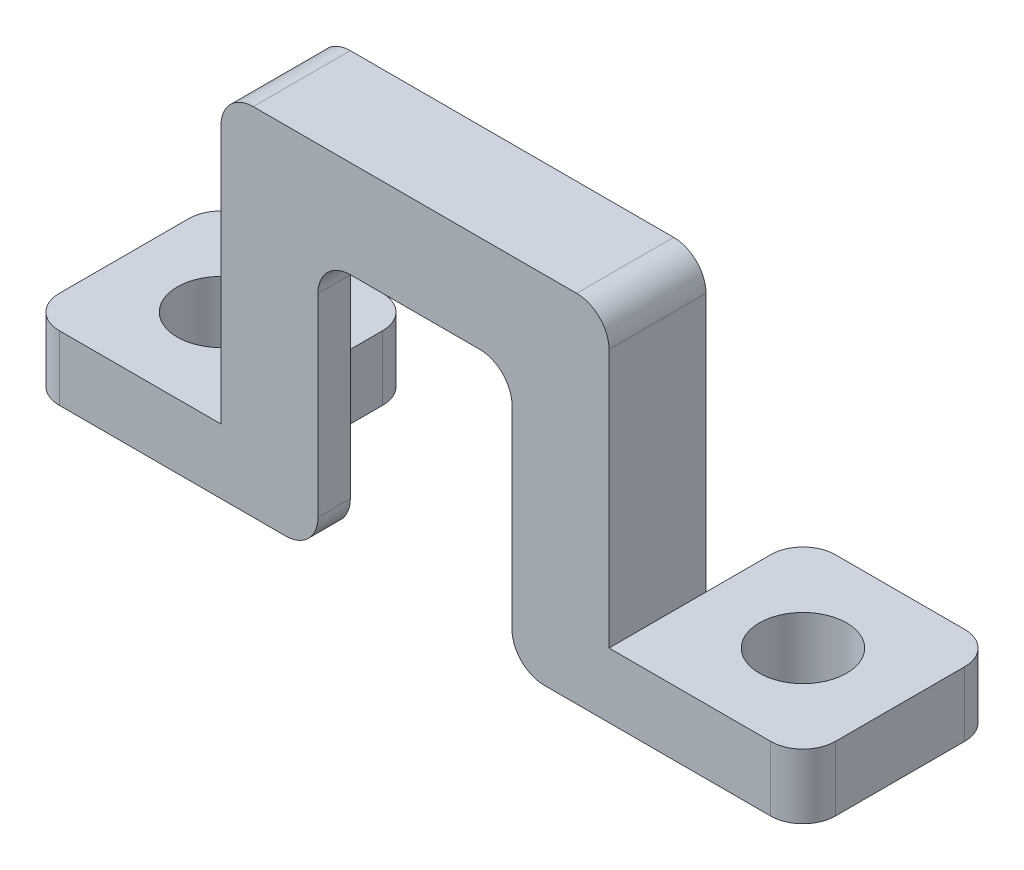
ISO-10303-21;
HEADER;
FILE_DESCRIPTION(('STEP AP214'),'2;1');
FILE_NAME('part.step','',(''),(''),'','','');
FILE_SCHEMA(('AUTOMOTIVE_DESIGN { 1 0 10303 214 1 1 1 1 }'));
ENDSEC;
DATA;
#1=APPLICATION_CONTEXT('core data for automotive mechanical design processes');
#2=APPLICATION_PROTOCOL_DEFINITION('international standard','automotive_design',2000,#1);
#3=PRODUCT_CONTEXT('',#1,'mechanical');
#4=PRODUCT('Part','Part','',(#3));
#5=PRODUCT_RELATED_PRODUCT_CATEGORY('part','',(#4));
#6=PRODUCT_DEFINITION_FORMATION('','',#4);
#7=PRODUCT_DEFINITION_CONTEXT('part definition',#1,'design');
#8=PRODUCT_DEFINITION('design','',#6,#7);
#9=PRODUCT_DEFINITION_SHAPE('','',#8);
#10=(LENGTH_UNIT() NAMED_UNIT(*) SI_UNIT(.MILLI.,.METRE.));
#11=(NAMED_UNIT(*) PLANE_ANGLE_UNIT() SI_UNIT($,.RADIAN.));
#12=(NAMED_UNIT(*) SI_UNIT($,.STERADIAN.) SOLID_ANGLE_UNIT());
#13=UNCERTAINTY_MEASURE_WITH_UNIT(LENGTH_MEASURE(1.E-05),#10,'distance_accuracy_value','');
#14=(GEOMETRIC_REPRESENTATION_CONTEXT(3) GLOBAL_UNCERTAINTY_ASSIGNED_CONTEXT((#13)) GLOBAL_UNIT_ASSIGNED_CONTEXT((#10,
#11,#12)) REPRESENTATION_CONTEXT('',''));
#15=CARTESIAN_POINT('',(0.,0.,0.));
#16=DIRECTION('',(0.,0.,1.));
#17=DIRECTION('',(1.,0.,0.));
#18=AXIS2_PLACEMENT_3D('',#15,#16,#17);
#19=CARTESIAN_POINT('',(0.,0.,0.));
#20=DIRECTION('',(0.,0.,1.));
#21=DIRECTION('',(1.,0.,0.));
#22=AXIS2_PLACEMENT_3D('',#19,#20,#21);
#23=PLANE('',#22);
#24=DIRECTION('',(0.,1.,0.));
#25=VECTOR('',#24,1.);
#26=CARTESIAN_POINT('',(5.08,0.,0.));
#27=LINE('',#26,#25);
#28=CARTESIAN_POINT('',(5.08,2.54,0.));
#29=VERTEX_POINT('',#28);
#30=CARTESIAN_POINT('',(5.08,17.78,0.));
#31=VERTEX_POINT('',#30);
#32=EDGE_CURVE('E443',#29,#31,#27,.T.);
#33=ORIENTED_EDGE('',*,*,#32,.F.);
#34=CARTESIAN_POINT('',(2.54,2.54,0.));
#35=DIRECTION('',(0.,0.,1.));
#36=DIRECTION('',(1.,0.,0.));
#37=AXIS2_PLACEMENT_3D('',#34,#35,#36);
#38=CIRCLE('',#37,2.54);
#39=CARTESIAN_POINT('',(2.54,0.,0.));
#40=VERTEX_POINT('',#39);
#41=EDGE_CURVE('E473',#29,#40,#38,.F.);
#42=ORIENTED_EDGE('',*,*,#41,.T.);
#43=DIRECTION('',(1.,0.,0.));
#44=VECTOR('',#43,1.);
#45=CARTESIAN_POINT('',(0.,0.,0.));
#46=LINE('',#45,#44);
#47=CARTESIAN_POINT('',(0.,0.,0.));
#48=VERTEX_POINT('',#47);
#49=EDGE_CURVE('E439',#48,#40,#46,.T.);
#50=ORIENTED_EDGE('',*,*,#49,.F.);
#51=DIRECTION('',(0.,1.,0.));
#52=VECTOR('',#51,1.);
#53=CARTESIAN_POINT('',(0.,0.,0.));
#54=LINE('',#53,#52);
#55=CARTESIAN_POINT('',(0.,25.4,0.));
#56=VERTEX_POINT('',#55);
#57=EDGE_CURVE('E379',#48,#56,#54,.T.);
#58=ORIENTED_EDGE('',*,*,#57,.T.);
#59=DIRECTION('',(1.,0.,0.));
#60=VECTOR('',#59,1.);
#61=CARTESIAN_POINT('',(0.,25.4,0.));
#62=LINE('',#61,#60);
#63=CARTESIAN_POINT('',(25.4,25.4,0.));
#64=VERTEX_POINT('',#63);
#65=EDGE_CURVE('E354',#56,#64,#62,.T.);
#66=ORIENTED_EDGE('',*,*,#65,.T.);
#67=DIRECTION('',(0.,1.,0.));
#68=VECTOR('',#67,1.);
#69=CARTESIAN_POINT('',(25.4,0.,0.));
#70=LINE('',#69,#68);
#71=CARTESIAN_POINT('',(25.4,0.,0.));
#72=VERTEX_POINT('',#71);
#73=EDGE_CURVE('E338',#72,#64,#70,.T.);
#74=ORIENTED_EDGE('',*,*,#73,.F.);
#75=DIRECTION('',(1.,0.,0.));
#76=VECTOR('',#75,1.);
#77=CARTESIAN_POINT('',(0.,0.,0.));
#78=LINE('',#77,#76);
#79=CARTESIAN_POINT('',(22.86,0.,0.));
#80=VERTEX_POINT('',#79);
#81=EDGE_CURVE('E436',#80,#72,#78,.T.);
#82=ORIENTED_EDGE('',*,*,#81,.F.);
#83=CARTESIAN_POINT('',(22.86,2.54,0.));
#84=DIRECTION('',(0.,0.,1.));
#85=DIRECTION('',(1.,0.,0.));
#86=AXIS2_PLACEMENT_3D('',#83,#84,#85);
#87=CIRCLE('',#86,2.54);
#88=CARTESIAN_POINT('',(20.32,2.54,0.));
#89=VERTEX_POINT('',#88);
#90=EDGE_CURVE('E470',#80,#89,#87,.F.);
#91=ORIENTED_EDGE('',*,*,#90,.T.);
#92=DIRECTION('',(0.,1.,0.));
#93=VECTOR('',#92,1.);
#94=CARTESIAN_POINT('',(20.32,0.,0.));
#95=LINE('',#94,#93);
#96=CARTESIAN_POINT('',(20.32,17.78,0.));
#97=VERTEX_POINT('',#96);
#98=EDGE_CURVE('E390',#89,#97,#95,.T.);
#99=ORIENTED_EDGE('',*,*,#98,.T.);
#100=CARTESIAN_POINT('',(17.78,17.78,0.));
#101=DIRECTION('',(0.,0.,1.));
#102=DIRECTION('',(1.,0.,0.));
#103=AXIS2_PLACEMENT_3D('',#100,#101,#102);
#104=CIRCLE('',#103,2.54);
#105=CARTESIAN_POINT('',(17.78,20.32,0.));
#106=VERTEX_POINT('',#105);
#107=EDGE_CURVE('E588',#97,#106,#104,.T.);
#108=ORIENTED_EDGE('',*,*,#107,.T.);
#109=DIRECTION('',(1.,0.,0.));
#110=VECTOR('',#109,1.);
#111=CARTESIAN_POINT('',(0.,20.32,0.));
#112=LINE('',#111,#110);
#113=CARTESIAN_POINT('',(7.62,20.32,0.));
#114=VERTEX_POINT('',#113);
#115=EDGE_CURVE('E405',#114,#106,#112,.T.);
#116=ORIENTED_EDGE('',*,*,#115,.F.);
#117=CARTESIAN_POINT('',(7.62,17.78,0.));
#118=DIRECTION('',(0.,0.,1.));
#119=DIRECTION('',(1.,0.,0.));
#120=AXIS2_PLACEMENT_3D('',#117,#118,#119);
#121=CIRCLE('',#120,2.54);
#122=EDGE_CURVE('E56',#114,#31,#121,.T.);
#123=ORIENTED_EDGE('',*,*,#122,.T.);
#124=EDGE_LOOP('',(#33,#42,#50,#58,#66,#74,#82,#91,#99,#108,#116,#123));
#125=FACE_BOUND('',#124,.T.);
#126=ADVANCED_FACE('F47',(#125),#23,.F.);
#127=CARTESIAN_POINT('',(20.32,0.,2.54));
#128=DIRECTION('',(-1.,0.,0.));
#129=DIRECTION('',(0.,0.,1.));
#130=AXIS2_PLACEMENT_3D('',#127,#128,#129);
#131=PLANE('',#130);
#132=DIRECTION('',(0.,1.,0.));
#133=VECTOR('',#132,1.);
#134=CARTESIAN_POINT('',(20.32,0.,2.54));
#135=LINE('',#134,#133);
#136=CARTESIAN_POINT('',(20.32,2.54,2.54));
#137=VERTEX_POINT('',#136);
#138=CARTESIAN_POINT('',(20.32,17.78,2.54));
#139=VERTEX_POINT('',#138);
#140=EDGE_CURVE('E400',#137,#139,#135,.T.);
#141=ORIENTED_EDGE('',*,*,#140,.T.);
#142=DIRECTION('',(0.,0.,-1.));
#143=VECTOR('',#142,1.);
#144=CARTESIAN_POINT('',(20.32,17.78,2.54));
#145=LINE('',#144,#143);
#146=EDGE_CURVE('E452',#139,#97,#145,.T.);
#147=ORIENTED_EDGE('',*,*,#146,.T.);
#148=ORIENTED_EDGE('',*,*,#98,.F.);
#149=DIRECTION('',(0.,0.,-1.));
#150=VECTOR('',#149,1.);
#151=CARTESIAN_POINT('',(20.32,2.54,2.54));
#152=LINE('',#151,#150);
#153=EDGE_CURVE('E432',#89,#137,#152,.F.);
#154=ORIENTED_EDGE('',*,*,#153,.T.);
#155=EDGE_LOOP('',(#141,#147,#148,#154));
#156=FACE_BOUND('',#155,.T.);
#157=ADVANCED_FACE('F619',(#156),#131,.T.);
#158=CARTESIAN_POINT('',(0.,0.,2.54));
#159=DIRECTION('',(0.,1.,0.));
#160=DIRECTION('',(0.,0.,1.));
#161=AXIS2_PLACEMENT_3D('',#158,#159,#160);
#162=PLANE('',#161);
#163=DIRECTION('',(1.,0.,0.));
#164=VECTOR('',#163,1.);
#165=CARTESIAN_POINT('',(0.,0.,2.54));
#166=LINE('',#165,#164);
#167=CARTESIAN_POINT('',(22.86,0.,2.54));
#168=VERTEX_POINT('',#167);
#169=CARTESIAN_POINT('',(40.64,0.,2.54));
#170=VERTEX_POINT('',#169);
#171=EDGE_CURVE('E404',#168,#170,#166,.T.);
#172=ORIENTED_EDGE('',*,*,#171,.F.);
#173=DIRECTION('',(0.,0.,-1.));
#174=VECTOR('',#173,1.);
#175=CARTESIAN_POINT('',(22.86,0.,0.));
#176=LINE('',#175,#174);
#177=EDGE_CURVE('E516',#168,#80,#176,.T.);
#178=ORIENTED_EDGE('',*,*,#177,.T.);
#179=ORIENTED_EDGE('',*,*,#81,.T.);
#180=DIRECTION('',(0.,0.,1.));
#181=VECTOR('',#180,1.);
#182=CARTESIAN_POINT('',(25.4,0.,-5.08));
#183=LINE('',#182,#181);
#184=CARTESIAN_POINT('',(25.4,0.,-5.08));
#185=VERTEX_POINT('',#184);
#186=EDGE_CURVE('E376',#185,#72,#183,.T.);
#187=ORIENTED_EDGE('',*,*,#186,.F.);
#188=DIRECTION('',(1.,0.,0.));
#189=VECTOR('',#188,1.);
#190=CARTESIAN_POINT('',(0.,0.,-5.08));
#191=LINE('',#190,#189);
#192=CARTESIAN_POINT('',(27.94,0.,-5.08));
#193=VERTEX_POINT('',#192);
#194=EDGE_CURVE('E353',#185,#193,#191,.T.);
#195=ORIENTED_EDGE('',*,*,#194,.T.);
#196=DIRECTION('',(0.,0.,-1.));
#197=VECTOR('',#196,1.);
#198=CARTESIAN_POINT('',(27.94,0.,2.54));
#199=LINE('',#198,#197);
#200=CARTESIAN_POINT('',(27.94,0.,-10.16));
#201=VERTEX_POINT('',#200);
#202=EDGE_CURVE('E318',#193,#201,#199,.T.);
#203=ORIENTED_EDGE('',*,*,#202,.T.);
#204=CARTESIAN_POINT('',(30.48,0.,-10.16));
#205=DIRECTION('',(0.,1.,0.));
#206=DIRECTION('',(0.,0.,1.));
#207=AXIS2_PLACEMENT_3D('',#204,#205,#206);
#208=CIRCLE('',#207,2.54);
#209=CARTESIAN_POINT('',(30.48,0.,-12.7));
#210=VERTEX_POINT('',#209);
#211=EDGE_CURVE('E513',#201,#210,#208,.F.);
#212=ORIENTED_EDGE('',*,*,#211,.T.);
#213=DIRECTION('',(1.,0.,0.));
#214=VECTOR('',#213,1.);
#215=CARTESIAN_POINT('',(27.94,0.,-12.7));
#216=LINE('',#215,#214);
#217=CARTESIAN_POINT('',(40.64,0.,-12.7));
#218=VERTEX_POINT('',#217);
#219=EDGE_CURVE('E342',#210,#218,#216,.T.);
#220=ORIENTED_EDGE('',*,*,#219,.T.);
#221=CARTESIAN_POINT('',(40.64,0.,-10.16));
#222=DIRECTION('',(0.,1.,0.));
#223=DIRECTION('',(0.,0.,1.));
#224=AXIS2_PLACEMENT_3D('',#221,#222,#223);
#225=CIRCLE('',#224,2.54);
#226=CARTESIAN_POINT('',(43.18,0.,-10.16));
#227=VERTEX_POINT('',#226);
#228=EDGE_CURVE('E510',#218,#227,#225,.F.);
#229=ORIENTED_EDGE('',*,*,#228,.T.);
#230=DIRECTION('',(0.,0.,1.));
#231=VECTOR('',#230,1.);
#232=CARTESIAN_POINT('',(43.18,0.,2.54));
#233=LINE('',#232,#231);
#234=CARTESIAN_POINT('',(43.18,0.,0.));
#235=VERTEX_POINT('',#234);
#236=EDGE_CURVE('E346',#227,#235,#233,.T.);
#237=ORIENTED_EDGE('',*,*,#236,.T.);
#238=CARTESIAN_POINT('',(40.64,0.,0.));
#239=DIRECTION('',(0.,1.,0.));
#240=DIRECTION('',(0.,0.,1.));
#241=AXIS2_PLACEMENT_3D('',#238,#239,#240);
#242=CIRCLE('',#241,2.54);
#243=EDGE_CURVE('E507',#235,#170,#242,.F.);
#244=ORIENTED_EDGE('',*,*,#243,.T.);
#245=EDGE_LOOP('',(#172,#178,#179,#187,#195,#203,#212,#220,#229,#237,#244));
#246=FACE_BOUND('',#245,.T.);
#247=CARTESIAN_POINT('',(35.56,0.,-5.08));
#248=DIRECTION('',(0.,-1.,0.));
#249=DIRECTION('',(0.,0.,-1.));
#250=AXIS2_PLACEMENT_3D('',#247,#248,#249);
#251=CIRCLE('',#250,3.429);
#252=CARTESIAN_POINT('',(35.56,0.,-8.509));
#253=VERTEX_POINT('',#252);
#254=EDGE_CURVE('E303',#253,#253,#251,.T.);
#255=ORIENTED_EDGE('',*,*,#254,.F.);
#256=EDGE_LOOP('',(#255));
#257=FACE_BOUND('',#256,.T.);
#258=ADVANCED_FACE('F628',(#246,#257),#162,.F.);
#259=CARTESIAN_POINT('',(27.94,0.,2.54));
#260=DIRECTION('',(-1.,0.,0.));
#261=DIRECTION('',(0.,0.,1.));
#262=AXIS2_PLACEMENT_3D('',#259,#260,#261);
#263=PLANE('',#262);
#264=DIRECTION('',(0.,1.,0.));
#265=VECTOR('',#264,1.);
#266=CARTESIAN_POINT('',(27.94,0.,-5.08));
#267=LINE('',#266,#265);
#268=CARTESIAN_POINT('',(27.94,5.08,-5.08));
#269=VERTEX_POINT('',#268);
#270=CARTESIAN_POINT('',(27.94,25.4,-5.08));
#271=VERTEX_POINT('',#270);
#272=EDGE_CURVE('E358',#269,#271,#267,.T.);
#273=ORIENTED_EDGE('',*,*,#272,.T.);
#274=DIRECTION('',(0.,0.,-1.));
#275=VECTOR('',#274,1.);
#276=CARTESIAN_POINT('',(27.94,25.4,2.54));
#277=LINE('',#276,#275);
#278=CARTESIAN_POINT('',(27.94,25.4,2.54));
#279=VERTEX_POINT('',#278);
#280=EDGE_CURVE('E535',#271,#279,#277,.F.);
#281=ORIENTED_EDGE('',*,*,#280,.T.);
#282=DIRECTION('',(0.,1.,0.));
#283=VECTOR('',#282,1.);
#284=CARTESIAN_POINT('',(27.94,0.,2.54));
#285=LINE('',#284,#283);
#286=CARTESIAN_POINT('',(27.94,5.08,2.54));
#287=VERTEX_POINT('',#286);
#288=EDGE_CURVE('E409',#287,#279,#285,.T.);
#289=ORIENTED_EDGE('',*,*,#288,.F.);
#290=DIRECTION('',(0.,0.,-1.));
#291=VECTOR('',#290,1.);
#292=CARTESIAN_POINT('',(27.94,5.08,2.54));
#293=LINE('',#292,#291);
#294=EDGE_CURVE('E322',#287,#269,#293,.T.);
#295=ORIENTED_EDGE('',*,*,#294,.T.);
#296=EDGE_LOOP('',(#273,#281,#289,#295));
#297=FACE_BOUND('',#296,.T.);
#298=ADVANCED_FACE('F667',(#297),#263,.F.);
#299=CARTESIAN_POINT('',(0.,27.94,2.54));
#300=DIRECTION('',(0.,1.,0.));
#301=DIRECTION('',(0.,0.,1.));
#302=AXIS2_PLACEMENT_3D('',#299,#300,#301);
#303=PLANE('',#302);
#304=DIRECTION('',(1.,0.,0.));
#305=VECTOR('',#304,1.);
#306=CARTESIAN_POINT('',(0.,27.94,-5.08));
#307=LINE('',#306,#305);
#308=CARTESIAN_POINT('',(0.,27.94,-5.08));
#309=VERTEX_POINT('',#308);
#310=CARTESIAN_POINT('',(25.4,27.94,-5.08));
#311=VERTEX_POINT('',#310);
#312=EDGE_CURVE('E276',#309,#311,#307,.T.);
#313=ORIENTED_EDGE('',*,*,#312,.F.);
#314=DIRECTION('',(0.,0.,-1.));
#315=VECTOR('',#314,1.);
#316=CARTESIAN_POINT('',(0.,27.94,2.54));
#317=LINE('',#316,#315);
#318=CARTESIAN_POINT('',(0.,27.94,2.54));
#319=VERTEX_POINT('',#318);
#320=EDGE_CURVE('E532',#309,#319,#317,.F.);
#321=ORIENTED_EDGE('',*,*,#320,.T.);
#322=DIRECTION('',(1.,0.,0.));
#323=VECTOR('',#322,1.);
#324=CARTESIAN_POINT('',(0.,27.94,2.54));
#325=LINE('',#324,#323);
#326=CARTESIAN_POINT('',(25.4,27.94,2.54));
#327=VERTEX_POINT('',#326);
#328=EDGE_CURVE('E413',#319,#327,#325,.T.);
#329=ORIENTED_EDGE('',*,*,#328,.T.);
#330=DIRECTION('',(0.,0.,-1.));
#331=VECTOR('',#330,1.);
#332=CARTESIAN_POINT('',(25.4,27.94,-5.08));
#333=LINE('',#332,#331);
#334=EDGE_CURVE('E528',#327,#311,#333,.T.);
#335=ORIENTED_EDGE('',*,*,#334,.T.);
#336=EDGE_LOOP('',(#313,#321,#329,#335));
#337=FACE_BOUND('',#336,.T.);
#338=ADVANCED_FACE('F677',(#337),#303,.T.);
#339=CARTESIAN_POINT('',(-2.54,0.,2.54));
#340=DIRECTION('',(-1.,0.,0.));
#341=DIRECTION('',(0.,0.,1.));
#342=AXIS2_PLACEMENT_3D('',#339,#340,#341);
#343=PLANE('',#342);
#344=DIRECTION('',(0.,1.,0.));
#345=VECTOR('',#344,1.);
#346=CARTESIAN_POINT('',(-2.54,0.,2.54));
#347=LINE('',#346,#345);
#348=CARTESIAN_POINT('',(-2.54,5.08,2.54));
#349=VERTEX_POINT('',#348);
#350=CARTESIAN_POINT('',(-2.54,25.4,2.54));
#351=VERTEX_POINT('',#350);
#352=EDGE_CURVE('E417',#349,#351,#347,.T.);
#353=ORIENTED_EDGE('',*,*,#352,.T.);
#354=DIRECTION('',(0.,0.,-1.));
#355=VECTOR('',#354,1.);
#356=CARTESIAN_POINT('',(-2.54,25.4,2.54));
#357=LINE('',#356,#355);
#358=CARTESIAN_POINT('',(-2.54,25.4,-5.08));
#359=VERTEX_POINT('',#358);
#360=EDGE_CURVE('E274',#351,#359,#357,.T.);
#361=ORIENTED_EDGE('',*,*,#360,.T.);
#362=DIRECTION('',(0.,1.,0.));
#363=VECTOR('',#362,1.);
#364=CARTESIAN_POINT('',(-2.54,0.,-5.08));
#365=LINE('',#364,#363);
#366=CARTESIAN_POINT('',(-2.54,5.08,-5.08));
#367=VERTEX_POINT('',#366);
#368=EDGE_CURVE('E255',#367,#359,#365,.T.);
#369=ORIENTED_EDGE('',*,*,#368,.F.);
#370=DIRECTION('',(0.,0.,-1.));
#371=VECTOR('',#370,1.);
#372=CARTESIAN_POINT('',(-2.54,5.08,2.54));
#373=LINE('',#372,#371);
#374=EDGE_CURVE('E271',#349,#367,#373,.T.);
#375=ORIENTED_EDGE('',*,*,#374,.F.);
#376=EDGE_LOOP('',(#353,#361,#369,#375));
#377=FACE_BOUND('',#376,.T.);
#378=ADVANCED_FACE('F269',(#377),#343,.T.);
#379=CARTESIAN_POINT('',(0.,0.,2.54));
#380=DIRECTION('',(0.,1.,0.));
#381=DIRECTION('',(0.,0.,1.));
#382=AXIS2_PLACEMENT_3D('',#379,#380,#381);
#383=PLANE('',#382);
#384=ORIENTED_EDGE('',*,*,#49,.T.);
#385=DIRECTION('',(0.,0.,-1.));
#386=VECTOR('',#385,1.);
#387=CARTESIAN_POINT('',(2.54,0.,2.54));
#388=LINE('',#387,#386);
#389=CARTESIAN_POINT('',(2.54,0.,2.54));
#390=VERTEX_POINT('',#389);
#391=EDGE_CURVE('E485',#40,#390,#388,.F.);
#392=ORIENTED_EDGE('',*,*,#391,.T.);
#393=DIRECTION('',(1.,0.,0.));
#394=VECTOR('',#393,1.);
#395=CARTESIAN_POINT('',(0.,0.,2.54));
#396=LINE('',#395,#394);
#397=CARTESIAN_POINT('',(-15.24,0.,2.54));
#398=VERTEX_POINT('',#397);
#399=EDGE_CURVE('E420',#398,#390,#396,.T.);
#400=ORIENTED_EDGE('',*,*,#399,.F.);
#401=CARTESIAN_POINT('',(-15.24,0.,0.));
#402=DIRECTION('',(0.,1.,0.));
#403=DIRECTION('',(0.,0.,1.));
#404=AXIS2_PLACEMENT_3D('',#401,#402,#403);
#405=CIRCLE('',#404,2.54);
#406=CARTESIAN_POINT('',(-17.78,0.,0.));
#407=VERTEX_POINT('',#406);
#408=EDGE_CURVE('E476',#398,#407,#405,.F.);
#409=ORIENTED_EDGE('',*,*,#408,.T.);
#410=DIRECTION('',(0.,0.,1.));
#411=VECTOR('',#410,1.);
#412=CARTESIAN_POINT('',(-17.78,0.,2.54));
#413=LINE('',#412,#411);
#414=CARTESIAN_POINT('',(-17.78,0.,-10.16));
#415=VERTEX_POINT('',#414);
#416=EDGE_CURVE('E307',#415,#407,#413,.T.);
#417=ORIENTED_EDGE('',*,*,#416,.F.);
#418=CARTESIAN_POINT('',(-15.24,0.,-10.16));
#419=DIRECTION('',(0.,1.,0.));
#420=DIRECTION('',(0.,0.,1.));
#421=AXIS2_PLACEMENT_3D('',#418,#419,#420);
#422=CIRCLE('',#421,2.54);
#423=CARTESIAN_POINT('',(-15.24,0.,-12.7));
#424=VERTEX_POINT('',#423);
#425=EDGE_CURVE('E479',#415,#424,#422,.F.);
#426=ORIENTED_EDGE('',*,*,#425,.T.);
#427=DIRECTION('',(-1.,0.,0.));
#428=VECTOR('',#427,1.);
#429=CARTESIAN_POINT('',(-2.54,0.,-12.7));
#430=LINE('',#429,#428);
#431=CARTESIAN_POINT('',(-5.08,0.,-12.7));
#432=VERTEX_POINT('',#431);
#433=EDGE_CURVE('E284',#432,#424,#430,.T.);
#434=ORIENTED_EDGE('',*,*,#433,.F.);
#435=CARTESIAN_POINT('',(-5.08,0.,-10.16));
#436=DIRECTION('',(0.,1.,0.));
#437=DIRECTION('',(0.,0.,1.));
#438=AXIS2_PLACEMENT_3D('',#435,#436,#437);
#439=CIRCLE('',#438,2.54);
#440=CARTESIAN_POINT('',(-2.54,0.,-10.16));
#441=VERTEX_POINT('',#440);
#442=EDGE_CURVE('E482',#432,#441,#439,.F.);
#443=ORIENTED_EDGE('',*,*,#442,.T.);
#444=DIRECTION('',(0.,0.,-1.));
#445=VECTOR('',#444,1.);
#446=CARTESIAN_POINT('',(-2.54,0.,2.54));
#447=LINE('',#446,#445);
#448=CARTESIAN_POINT('',(-2.54,0.,-5.08));
#449=VERTEX_POINT('',#448);
#450=EDGE_CURVE('E304',#449,#441,#447,.T.);
#451=ORIENTED_EDGE('',*,*,#450,.F.);
#452=DIRECTION('',(1.,0.,0.));
#453=VECTOR('',#452,1.);
#454=CARTESIAN_POINT('',(0.,0.,-5.08));
#455=LINE('',#454,#453);
#456=CARTESIAN_POINT('',(0.,0.,-5.08));
#457=VERTEX_POINT('',#456);
#458=EDGE_CURVE('E258',#449,#457,#455,.T.);
#459=ORIENTED_EDGE('',*,*,#458,.T.);
#460=DIRECTION('',(0.,0.,1.));
#461=VECTOR('',#460,1.);
#462=CARTESIAN_POINT('',(0.,0.,-5.08));
#463=LINE('',#462,#461);
#464=EDGE_CURVE('E394',#457,#48,#463,.T.);
#465=ORIENTED_EDGE('',*,*,#464,.T.);
#466=EDGE_LOOP('',(#384,#392,#400,#409,#417,#426,#434,#443,#451,#459,#465));
#467=FACE_BOUND('',#466,.T.);
#468=CARTESIAN_POINT('',(-10.16,0.,-5.08));
#469=DIRECTION('',(0.,1.,0.));
#470=DIRECTION('',(0.,0.,-1.));
#471=AXIS2_PLACEMENT_3D('',#468,#469,#470);
#472=CIRCLE('',#471,3.429);
#473=CARTESIAN_POINT('',(-10.16,0.,-8.509));
#474=VERTEX_POINT('',#473);
#475=EDGE_CURVE('E295',#474,#474,#472,.T.);
#476=ORIENTED_EDGE('',*,*,#475,.T.);
#477=EDGE_LOOP('',(#476));
#478=FACE_BOUND('',#477,.T.);
#479=ADVANCED_FACE('F687',(#467,#478),#383,.F.);
#480=CARTESIAN_POINT('',(5.08,0.,2.54));
#481=DIRECTION('',(-1.,0.,0.));
#482=DIRECTION('',(0.,0.,1.));
#483=AXIS2_PLACEMENT_3D('',#480,#481,#482);
#484=PLANE('',#483);
#485=ORIENTED_EDGE('',*,*,#32,.T.);
#486=DIRECTION('',(0.,0.,-1.));
#487=VECTOR('',#486,1.);
#488=CARTESIAN_POINT('',(5.08,17.78,2.54));
#489=LINE('',#488,#487);
#490=CARTESIAN_POINT('',(5.08,17.78,2.54));
#491=VERTEX_POINT('',#490);
#492=EDGE_CURVE('E467',#31,#491,#489,.F.);
#493=ORIENTED_EDGE('',*,*,#492,.T.);
#494=DIRECTION('',(0.,1.,0.));
#495=VECTOR('',#494,1.);
#496=CARTESIAN_POINT('',(5.08,0.,2.54));
#497=LINE('',#496,#495);
#498=CARTESIAN_POINT('',(5.08,2.54,2.54));
#499=VERTEX_POINT('',#498);
#500=EDGE_CURVE('E424',#499,#491,#497,.T.);
#501=ORIENTED_EDGE('',*,*,#500,.F.);
#502=DIRECTION('',(0.,0.,-1.));
#503=VECTOR('',#502,1.);
#504=CARTESIAN_POINT('',(5.08,2.54,2.54));
#505=LINE('',#504,#503);
#506=EDGE_CURVE('E463',#499,#29,#505,.T.);
#507=ORIENTED_EDGE('',*,*,#506,.T.);
#508=EDGE_LOOP('',(#485,#493,#501,#507));
#509=FACE_BOUND('',#508,.T.);
#510=ADVANCED_FACE('F601',(#509),#484,.F.);
#511=CARTESIAN_POINT('',(0.,20.32,2.54));
#512=DIRECTION('',(0.,1.,0.));
#513=DIRECTION('',(0.,0.,1.));
#514=AXIS2_PLACEMENT_3D('',#511,#512,#513);
#515=PLANE('',#514);
#516=ORIENTED_EDGE('',*,*,#115,.T.);
#517=DIRECTION('',(0.,0.,-1.));
#518=VECTOR('',#517,1.);
#519=CARTESIAN_POINT('',(17.78,20.32,2.54));
#520=LINE('',#519,#518);
#521=CARTESIAN_POINT('',(17.78,20.32,2.54));
#522=VERTEX_POINT('',#521);
#523=EDGE_CURVE('E460',#106,#522,#520,.F.);
#524=ORIENTED_EDGE('',*,*,#523,.T.);
#525=DIRECTION('',(1.,0.,0.));
#526=VECTOR('',#525,1.);
#527=CARTESIAN_POINT('',(0.,20.32,2.54));
#528=LINE('',#527,#526);
#529=CARTESIAN_POINT('',(7.62,20.32,2.54));
#530=VERTEX_POINT('',#529);
#531=EDGE_CURVE('E428',#530,#522,#528,.T.);
#532=ORIENTED_EDGE('',*,*,#531,.F.);
#533=DIRECTION('',(0.,0.,-1.));
#534=VECTOR('',#533,1.);
#535=CARTESIAN_POINT('',(7.62,20.32,0.));
#536=LINE('',#535,#534);
#537=EDGE_CURVE('E456',#530,#114,#536,.T.);
#538=ORIENTED_EDGE('',*,*,#537,.T.);
#539=EDGE_LOOP('',(#516,#524,#532,#538));
#540=FACE_BOUND('',#539,.T.);
#541=ADVANCED_FACE('F611',(#540),#515,.F.);
#542=CARTESIAN_POINT('',(0.,0.,2.54));
#543=DIRECTION('',(0.,0.,1.));
#544=DIRECTION('',(1.,0.,0.));
#545=AXIS2_PLACEMENT_3D('',#542,#543,#544);
#546=PLANE('',#545);
#547=ORIENTED_EDGE('',*,*,#399,.T.);
#548=CARTESIAN_POINT('',(2.54,2.54,2.54));
#549=DIRECTION('',(0.,0.,1.));
#550=DIRECTION('',(1.,0.,0.));
#551=AXIS2_PLACEMENT_3D('',#548,#549,#550);
#552=CIRCLE('',#551,2.54);
#553=EDGE_CURVE('E504',#390,#499,#552,.T.);
#554=ORIENTED_EDGE('',*,*,#553,.T.);
#555=ORIENTED_EDGE('',*,*,#500,.T.);
#556=CARTESIAN_POINT('',(7.62,17.78,2.54));
#557=DIRECTION('',(0.,0.,1.));
#558=DIRECTION('',(1.,0.,0.));
#559=AXIS2_PLACEMENT_3D('',#556,#557,#558);
#560=CIRCLE('',#559,2.54);
#561=EDGE_CURVE('E11',#491,#530,#560,.F.);
#562=ORIENTED_EDGE('',*,*,#561,.T.);
#563=ORIENTED_EDGE('',*,*,#531,.T.);
#564=CARTESIAN_POINT('',(17.78,17.78,2.54));
#565=DIRECTION('',(0.,0.,1.));
#566=DIRECTION('',(1.,0.,0.));
#567=AXIS2_PLACEMENT_3D('',#564,#565,#566);
#568=CIRCLE('',#567,2.54);
#569=EDGE_CURVE('E591',#522,#139,#568,.F.);
#570=ORIENTED_EDGE('',*,*,#569,.T.);
#571=ORIENTED_EDGE('',*,*,#140,.F.);
#572=CARTESIAN_POINT('',(22.86,2.54,2.54));
#573=DIRECTION('',(0.,0.,1.));
#574=DIRECTION('',(1.,0.,0.));
#575=AXIS2_PLACEMENT_3D('',#572,#573,#574);
#576=CIRCLE('',#575,2.54);
#577=EDGE_CURVE('E501',#137,#168,#576,.T.);
#578=ORIENTED_EDGE('',*,*,#577,.T.);
#579=ORIENTED_EDGE('',*,*,#171,.T.);
#580=DIRECTION('',(0.,-1.,0.));
#581=VECTOR('',#580,1.);
#582=CARTESIAN_POINT('',(40.64,0.,2.54));
#583=LINE('',#582,#581);
#584=CARTESIAN_POINT('',(40.64,5.08,2.54));
#585=VERTEX_POINT('',#584);
#586=EDGE_CURVE('E492',#170,#585,#583,.F.);
#587=ORIENTED_EDGE('',*,*,#586,.T.);
#588=DIRECTION('',(-1.,0.,0.));
#589=VECTOR('',#588,1.);
#590=CARTESIAN_POINT('',(27.94,5.08,2.54));
#591=LINE('',#590,#589);
#592=EDGE_CURVE('E335',#585,#287,#591,.T.);
#593=ORIENTED_EDGE('',*,*,#592,.T.);
#594=ORIENTED_EDGE('',*,*,#288,.T.);
#595=CARTESIAN_POINT('',(25.4,25.4,2.54));
#596=DIRECTION('',(0.,0.,1.));
#597=DIRECTION('',(1.,0.,0.));
#598=AXIS2_PLACEMENT_3D('',#595,#596,#597);
#599=CIRCLE('',#598,2.54);
#600=EDGE_CURVE('E495',#279,#327,#599,.T.);
#601=ORIENTED_EDGE('',*,*,#600,.T.);
#602=ORIENTED_EDGE('',*,*,#328,.F.);
#603=CARTESIAN_POINT('',(0.,25.4,2.54));
#604=DIRECTION('',(0.,0.,1.));
#605=DIRECTION('',(1.,0.,0.));
#606=AXIS2_PLACEMENT_3D('',#603,#604,#605);
#607=CIRCLE('',#606,2.54);
#608=EDGE_CURVE('E498',#319,#351,#607,.T.);
#609=ORIENTED_EDGE('',*,*,#608,.T.);
#610=ORIENTED_EDGE('',*,*,#352,.F.);
#611=DIRECTION('',(1.,0.,0.));
#612=VECTOR('',#611,1.);
#613=CARTESIAN_POINT('',(-2.54,5.08,2.54));
#614=LINE('',#613,#612);
#615=CARTESIAN_POINT('',(-15.24,5.08,2.54));
#616=VERTEX_POINT('',#615);
#617=EDGE_CURVE('E289',#616,#349,#614,.T.);
#618=ORIENTED_EDGE('',*,*,#617,.F.);
#619=DIRECTION('',(0.,-1.,0.));
#620=VECTOR('',#619,1.);
#621=CARTESIAN_POINT('',(-15.24,0.,2.54));
#622=LINE('',#621,#620);
#623=EDGE_CURVE('E488',#616,#398,#622,.T.);
#624=ORIENTED_EDGE('',*,*,#623,.T.);
#625=EDGE_LOOP('',(#547,#554,#555,#562,#563,#570,#571,#578,#579,#587,#593,#594,#601,#602,#609,
#610,#618,#624));
#626=FACE_BOUND('',#625,.T.);
#627=ADVANCED_FACE('F608',(#626),#546,.T.);
#628=CARTESIAN_POINT('',(25.4,0.,-5.08));
#629=DIRECTION('',(1.,0.,0.));
#630=DIRECTION('',(0.,0.,-1.));
#631=AXIS2_PLACEMENT_3D('',#628,#629,#630);
#632=PLANE('',#631);
#633=ORIENTED_EDGE('',*,*,#73,.T.);
#634=DIRECTION('',(0.,0.,1.));
#635=VECTOR('',#634,1.);
#636=CARTESIAN_POINT('',(25.4,25.4,-5.08));
#637=LINE('',#636,#635);
#638=CARTESIAN_POINT('',(25.4,25.4,-5.08));
#639=VERTEX_POINT('',#638);
#640=EDGE_CURVE('E386',#639,#64,#637,.T.);
#641=ORIENTED_EDGE('',*,*,#640,.F.);
#642=DIRECTION('',(0.,1.,0.));
#643=VECTOR('',#642,1.);
#644=CARTESIAN_POINT('',(25.4,0.,-5.08));
#645=LINE('',#644,#643);
#646=EDGE_CURVE('E350',#185,#639,#645,.T.);
#647=ORIENTED_EDGE('',*,*,#646,.F.);
#648=ORIENTED_EDGE('',*,*,#186,.T.);
#649=EDGE_LOOP('',(#633,#641,#647,#648));
#650=FACE_BOUND('',#649,.T.);
#651=ADVANCED_FACE('F779',(#650),#632,.F.);
#652=CARTESIAN_POINT('',(0.,25.4,-5.08));
#653=DIRECTION('',(0.,-1.,0.));
#654=DIRECTION('',(0.,0.,-1.));
#655=AXIS2_PLACEMENT_3D('',#652,#653,#654);
#656=PLANE('',#655);
#657=ORIENTED_EDGE('',*,*,#65,.F.);
#658=DIRECTION('',(0.,0.,1.));
#659=VECTOR('',#658,1.);
#660=CARTESIAN_POINT('',(0.,25.4,-5.08));
#661=LINE('',#660,#659);
#662=CARTESIAN_POINT('',(0.,25.4,-5.08));
#663=VERTEX_POINT('',#662);
#664=EDGE_CURVE('E391',#663,#56,#661,.T.);
#665=ORIENTED_EDGE('',*,*,#664,.F.);
#666=DIRECTION('',(1.,0.,0.));
#667=VECTOR('',#666,1.);
#668=CARTESIAN_POINT('',(0.,25.4,-5.08));
#669=LINE('',#668,#667);
#670=EDGE_CURVE('E372',#663,#639,#669,.T.);
#671=ORIENTED_EDGE('',*,*,#670,.T.);
#672=ORIENTED_EDGE('',*,*,#640,.T.);
#673=EDGE_LOOP('',(#657,#665,#671,#672));
#674=FACE_BOUND('',#673,.T.);
#675=ADVANCED_FACE('F776',(#674),#656,.T.);
#676=CARTESIAN_POINT('',(0.,0.,-5.08));
#677=DIRECTION('',(1.,0.,0.));
#678=DIRECTION('',(0.,0.,-1.));
#679=AXIS2_PLACEMENT_3D('',#676,#677,#678);
#680=PLANE('',#679);
#681=ORIENTED_EDGE('',*,*,#57,.F.);
#682=ORIENTED_EDGE('',*,*,#464,.F.);
#683=DIRECTION('',(0.,1.,0.));
#684=VECTOR('',#683,1.);
#685=CARTESIAN_POINT('',(0.,0.,-5.08));
#686=LINE('',#685,#684);
#687=EDGE_CURVE('E368',#457,#663,#686,.T.);
#688=ORIENTED_EDGE('',*,*,#687,.T.);
#689=ORIENTED_EDGE('',*,*,#664,.T.);
#690=EDGE_LOOP('',(#681,#682,#688,#689));
#691=FACE_BOUND('',#690,.T.);
#692=ADVANCED_FACE('F705',(#691),#680,.T.);
#693=CARTESIAN_POINT('',(0.,0.,-5.08));
#694=DIRECTION('',(0.,0.,1.));
#695=DIRECTION('',(1.,0.,0.));
#696=AXIS2_PLACEMENT_3D('',#693,#694,#695);
#697=PLANE('',#696);
#698=ORIENTED_EDGE('',*,*,#368,.T.);
#699=CARTESIAN_POINT('',(0.,25.4,-5.08));
#700=DIRECTION('',(0.,0.,1.));
#701=DIRECTION('',(1.,0.,0.));
#702=AXIS2_PLACEMENT_3D('',#699,#700,#701);
#703=CIRCLE('',#702,2.54);
#704=EDGE_CURVE('E525',#359,#309,#703,.F.);
#705=ORIENTED_EDGE('',*,*,#704,.T.);
#706=ORIENTED_EDGE('',*,*,#312,.T.);
#707=CARTESIAN_POINT('',(25.4,25.4,-5.08));
#708=DIRECTION('',(0.,0.,1.));
#709=DIRECTION('',(1.,0.,0.));
#710=AXIS2_PLACEMENT_3D('',#707,#708,#709);
#711=CIRCLE('',#710,2.54);
#712=EDGE_CURVE('E522',#311,#271,#711,.F.);
#713=ORIENTED_EDGE('',*,*,#712,.T.);
#714=ORIENTED_EDGE('',*,*,#272,.F.);
#715=EDGE_CURVE('E359',#193,#269,#267,.T.);
#716=ORIENTED_EDGE('',*,*,#715,.F.);
#717=ORIENTED_EDGE('',*,*,#194,.F.);
#718=ORIENTED_EDGE('',*,*,#646,.T.);
#719=ORIENTED_EDGE('',*,*,#670,.F.);
#720=ORIENTED_EDGE('',*,*,#687,.F.);
#721=ORIENTED_EDGE('',*,*,#458,.F.);
#722=EDGE_CURVE('E252',#449,#367,#365,.T.);
#723=ORIENTED_EDGE('',*,*,#722,.T.);
#724=EDGE_LOOP('',(#698,#705,#706,#713,#714,#716,#717,#718,#719,#720,#721,#723));
#725=FACE_BOUND('',#724,.T.);
#726=ADVANCED_FACE('F254',(#725),#697,.F.);
#727=CARTESIAN_POINT('',(27.94,5.08,2.54));
#728=DIRECTION('',(-1.,0.,0.));
#729=DIRECTION('',(0.,0.,1.));
#730=AXIS2_PLACEMENT_3D('',#727,#728,#729);
#731=PLANE('',#730);
#732=CARTESIAN_POINT('',(27.94,5.08,-10.16));
#733=VERTEX_POINT('',#732);
#734=EDGE_CURVE('E327',#269,#733,#293,.T.);
#735=ORIENTED_EDGE('',*,*,#734,.T.);
#736=DIRECTION('',(0.,-1.,0.));
#737=VECTOR('',#736,1.);
#738=CARTESIAN_POINT('',(27.94,5.08,-10.16));
#739=LINE('',#738,#737);
#740=EDGE_CURVE('E538',#733,#201,#739,.T.);
#741=ORIENTED_EDGE('',*,*,#740,.T.);
#742=ORIENTED_EDGE('',*,*,#202,.F.);
#743=ORIENTED_EDGE('',*,*,#715,.T.);
#744=EDGE_LOOP('',(#735,#741,#742,#743));
#745=FACE_BOUND('',#744,.T.);
#746=ADVANCED_FACE('F658',(#745),#731,.T.);
#747=CARTESIAN_POINT('',(43.18,5.08,2.54));
#748=DIRECTION('',(1.,0.,0.));
#749=DIRECTION('',(0.,0.,-1.));
#750=AXIS2_PLACEMENT_3D('',#747,#748,#749);
#751=PLANE('',#750);
#752=ORIENTED_EDGE('',*,*,#236,.F.);
#753=DIRECTION('',(0.,-1.,0.));
#754=VECTOR('',#753,1.);
#755=CARTESIAN_POINT('',(43.18,5.08,-10.16));
#756=LINE('',#755,#754);
#757=CARTESIAN_POINT('',(43.18,5.08,-10.16));
#758=VERTEX_POINT('',#757);
#759=EDGE_CURVE('E562',#227,#758,#756,.F.);
#760=ORIENTED_EDGE('',*,*,#759,.T.);
#761=DIRECTION('',(0.,0.,1.));
#762=VECTOR('',#761,1.);
#763=CARTESIAN_POINT('',(43.18,5.08,2.54));
#764=LINE('',#763,#762);
#765=CARTESIAN_POINT('',(43.18,5.08,0.));
#766=VERTEX_POINT('',#765);
#767=EDGE_CURVE('E331',#758,#766,#764,.T.);
#768=ORIENTED_EDGE('',*,*,#767,.T.);
#769=DIRECTION('',(0.,-1.,0.));
#770=VECTOR('',#769,1.);
#771=CARTESIAN_POINT('',(43.18,5.08,0.));
#772=LINE('',#771,#770);
#773=EDGE_CURVE('E558',#766,#235,#772,.T.);
#774=ORIENTED_EDGE('',*,*,#773,.T.);
#775=EDGE_LOOP('',(#752,#760,#768,#774));
#776=FACE_BOUND('',#775,.T.);
#777=ADVANCED_FACE('F637',(#776),#751,.T.);
#778=CARTESIAN_POINT('',(27.94,5.08,-12.7));
#779=DIRECTION('',(0.,0.,-1.));
#780=DIRECTION('',(-1.,0.,0.));
#781=AXIS2_PLACEMENT_3D('',#778,#779,#780);
#782=PLANE('',#781);
#783=ORIENTED_EDGE('',*,*,#219,.F.);
#784=DIRECTION('',(0.,-1.,0.));
#785=VECTOR('',#784,1.);
#786=CARTESIAN_POINT('',(30.48,5.08,-12.7));
#787=LINE('',#786,#785);
#788=CARTESIAN_POINT('',(30.48,5.08,-12.7));
#789=VERTEX_POINT('',#788);
#790=EDGE_CURVE('E546',#210,#789,#787,.F.);
#791=ORIENTED_EDGE('',*,*,#790,.T.);
#792=DIRECTION('',(1.,0.,0.));
#793=VECTOR('',#792,1.);
#794=CARTESIAN_POINT('',(27.94,5.08,-12.7));
#795=LINE('',#794,#793);
#796=CARTESIAN_POINT('',(40.64,5.08,-12.7));
#797=VERTEX_POINT('',#796);
#798=EDGE_CURVE('E326',#789,#797,#795,.T.);
#799=ORIENTED_EDGE('',*,*,#798,.T.);
#800=DIRECTION('',(0.,-1.,0.));
#801=VECTOR('',#800,1.);
#802=CARTESIAN_POINT('',(40.64,5.08,-12.7));
#803=LINE('',#802,#801);
#804=EDGE_CURVE('E542',#797,#218,#803,.T.);
#805=ORIENTED_EDGE('',*,*,#804,.T.);
#806=EDGE_LOOP('',(#783,#791,#799,#805));
#807=FACE_BOUND('',#806,.T.);
#808=ADVANCED_FACE('F650',(#807),#782,.T.);
#809=CARTESIAN_POINT('',(0.,5.08,0.));
#810=DIRECTION('',(0.,-1.,0.));
#811=DIRECTION('',(0.,0.,-1.));
#812=AXIS2_PLACEMENT_3D('',#809,#810,#811);
#813=PLANE('',#812);
#814=CARTESIAN_POINT('',(35.56,5.08,-5.08));
#815=DIRECTION('',(0.,-1.,0.));
#816=DIRECTION('',(0.,0.,-1.));
#817=AXIS2_PLACEMENT_3D('',#814,#815,#816);
#818=CIRCLE('',#817,3.429);
#819=CARTESIAN_POINT('',(35.56,5.08,-8.509));
#820=VERTEX_POINT('',#819);
#821=EDGE_CURVE('E314',#820,#820,#818,.T.);
#822=ORIENTED_EDGE('',*,*,#821,.T.);
#823=EDGE_LOOP('',(#822));
#824=FACE_BOUND('',#823,.T.);
#825=ORIENTED_EDGE('',*,*,#798,.F.);
#826=CARTESIAN_POINT('',(30.48,5.08,-10.16));
#827=DIRECTION('',(0.,-1.,0.));
#828=DIRECTION('',(0.,0.,-1.));
#829=AXIS2_PLACEMENT_3D('',#826,#827,#828);
#830=CIRCLE('',#829,2.54);
#831=EDGE_CURVE('E555',#789,#733,#830,.F.);
#832=ORIENTED_EDGE('',*,*,#831,.T.);
#833=ORIENTED_EDGE('',*,*,#734,.F.);
#834=ORIENTED_EDGE('',*,*,#294,.F.);
#835=ORIENTED_EDGE('',*,*,#592,.F.);
#836=CARTESIAN_POINT('',(40.64,5.08,0.));
#837=DIRECTION('',(0.,-1.,0.));
#838=DIRECTION('',(0.,0.,-1.));
#839=AXIS2_PLACEMENT_3D('',#836,#837,#838);
#840=CIRCLE('',#839,2.54);
#841=EDGE_CURVE('E549',#585,#766,#840,.F.);
#842=ORIENTED_EDGE('',*,*,#841,.T.);
#843=ORIENTED_EDGE('',*,*,#767,.F.);
#844=CARTESIAN_POINT('',(40.64,5.08,-10.16));
#845=DIRECTION('',(0.,-1.,0.));
#846=DIRECTION('',(0.,0.,-1.));
#847=AXIS2_PLACEMENT_3D('',#844,#845,#846);
#848=CIRCLE('',#847,2.54);
#849=EDGE_CURVE('E552',#758,#797,#848,.F.);
#850=ORIENTED_EDGE('',*,*,#849,.T.);
#851=EDGE_LOOP('',(#825,#832,#833,#834,#835,#842,#843,#850));
#852=FACE_BOUND('',#851,.T.);
#853=ADVANCED_FACE('F643',(#824,#852),#813,.F.);
#854=CARTESIAN_POINT('',(35.56,5.08,-5.08));
#855=DIRECTION('',(0.,-1.,0.));
#856=DIRECTION('',(0.,0.,-1.));
#857=AXIS2_PLACEMENT_3D('',#854,#855,#856);
#858=CYLINDRICAL_SURFACE('',#857,3.429);
#859=ORIENTED_EDGE('',*,*,#821,.F.);
#860=EDGE_LOOP('',(#859));
#861=FACE_BOUND('',#860,.T.);
#862=ORIENTED_EDGE('',*,*,#254,.T.);
#863=EDGE_LOOP('',(#862));
#864=FACE_BOUND('',#863,.T.);
#865=ADVANCED_FACE('F757',(#861,#864),#858,.F.);
#866=CARTESIAN_POINT('',(25.4,5.08,0.));
#867=DIRECTION('',(0.,-1.,0.));
#868=DIRECTION('',(0.,0.,-1.));
#869=AXIS2_PLACEMENT_3D('',#866,#867,#868);
#870=PLANE('',#869);
#871=CARTESIAN_POINT('',(-2.54,5.08,-10.16));
#872=VERTEX_POINT('',#871);
#873=EDGE_CURVE('E278',#367,#872,#373,.T.);
#874=ORIENTED_EDGE('',*,*,#873,.T.);
#875=CARTESIAN_POINT('',(-5.08,5.08,-10.16));
#876=DIRECTION('',(0.,-1.,0.));
#877=DIRECTION('',(0.,0.,-1.));
#878=AXIS2_PLACEMENT_3D('',#875,#876,#877);
#879=CIRCLE('',#878,2.54);
#880=CARTESIAN_POINT('',(-5.08,5.08,-12.7));
#881=VERTEX_POINT('',#880);
#882=EDGE_CURVE('E579',#872,#881,#879,.F.);
#883=ORIENTED_EDGE('',*,*,#882,.T.);
#884=DIRECTION('',(-1.,0.,0.));
#885=VECTOR('',#884,1.);
#886=CARTESIAN_POINT('',(-2.54,5.08,-12.7));
#887=LINE('',#886,#885);
#888=CARTESIAN_POINT('',(-15.24,5.08,-12.7));
#889=VERTEX_POINT('',#888);
#890=EDGE_CURVE('E300',#881,#889,#887,.T.);
#891=ORIENTED_EDGE('',*,*,#890,.T.);
#892=CARTESIAN_POINT('',(-15.24,5.08,-10.16));
#893=DIRECTION('',(0.,-1.,0.));
#894=DIRECTION('',(0.,0.,-1.));
#895=AXIS2_PLACEMENT_3D('',#892,#893,#894);
#896=CIRCLE('',#895,2.54);
#897=CARTESIAN_POINT('',(-17.78,5.08,-10.16));
#898=VERTEX_POINT('',#897);
#899=EDGE_CURVE('E70',#889,#898,#896,.F.);
#900=ORIENTED_EDGE('',*,*,#899,.T.);
#901=DIRECTION('',(0.,0.,1.));
#902=VECTOR('',#901,1.);
#903=CARTESIAN_POINT('',(-17.78,5.08,2.54));
#904=LINE('',#903,#902);
#905=CARTESIAN_POINT('',(-17.78,5.08,0.));
#906=VERTEX_POINT('',#905);
#907=EDGE_CURVE('E292',#898,#906,#904,.T.);
#908=ORIENTED_EDGE('',*,*,#907,.T.);
#909=CARTESIAN_POINT('',(-15.24,5.08,0.));
#910=DIRECTION('',(0.,-1.,0.));
#911=DIRECTION('',(0.,0.,-1.));
#912=AXIS2_PLACEMENT_3D('',#909,#910,#911);
#913=CIRCLE('',#912,2.54);
#914=EDGE_CURVE('E574',#906,#616,#913,.F.);
#915=ORIENTED_EDGE('',*,*,#914,.T.);
#916=ORIENTED_EDGE('',*,*,#617,.T.);
#917=ORIENTED_EDGE('',*,*,#374,.T.);
#918=EDGE_LOOP('',(#874,#883,#891,#900,#908,#915,#916,#917));
#919=FACE_BOUND('',#918,.T.);
#920=CARTESIAN_POINT('',(-10.16,5.08,-5.08));
#921=DIRECTION('',(0.,1.,0.));
#922=DIRECTION('',(0.,0.,-1.));
#923=AXIS2_PLACEMENT_3D('',#920,#921,#922);
#924=CIRCLE('',#923,3.429);
#925=CARTESIAN_POINT('',(-10.16,5.08,-8.509));
#926=VERTEX_POINT('',#925);
#927=EDGE_CURVE('E308',#926,#926,#924,.T.);
#928=ORIENTED_EDGE('',*,*,#927,.F.);
#929=EDGE_LOOP('',(#928));
#930=FACE_BOUND('',#929,.T.);
#931=ADVANCED_FACE('F286',(#919,#930),#870,.F.);
#932=CARTESIAN_POINT('',(-2.54,5.08,2.54));
#933=DIRECTION('',(-1.,0.,0.));
#934=DIRECTION('',(0.,0.,1.));
#935=AXIS2_PLACEMENT_3D('',#932,#933,#934);
#936=PLANE('',#935);
#937=ORIENTED_EDGE('',*,*,#450,.T.);
#938=DIRECTION('',(0.,-1.,0.));
#939=VECTOR('',#938,1.);
#940=CARTESIAN_POINT('',(-2.54,5.08,-10.16));
#941=LINE('',#940,#939);
#942=EDGE_CURVE('E281',#441,#872,#941,.F.);
#943=ORIENTED_EDGE('',*,*,#942,.T.);
#944=ORIENTED_EDGE('',*,*,#873,.F.);
#945=ORIENTED_EDGE('',*,*,#722,.F.);
#946=EDGE_LOOP('',(#937,#943,#944,#945));
#947=FACE_BOUND('',#946,.T.);
#948=ADVANCED_FACE('F279',(#947),#936,.F.);
#949=CARTESIAN_POINT('',(-2.54,5.08,-12.7));
#950=DIRECTION('',(0.,0.,1.));
#951=DIRECTION('',(1.,0.,0.));
#952=AXIS2_PLACEMENT_3D('',#949,#950,#951);
#953=PLANE('',#952);
#954=ORIENTED_EDGE('',*,*,#890,.F.);
#955=DIRECTION('',(0.,-1.,0.));
#956=VECTOR('',#955,1.);
#957=CARTESIAN_POINT('',(-5.08,5.08,-12.7));
#958=LINE('',#957,#956);
#959=EDGE_CURVE('E568',#881,#432,#958,.T.);
#960=ORIENTED_EDGE('',*,*,#959,.T.);
#961=ORIENTED_EDGE('',*,*,#433,.T.);
#962=DIRECTION('',(0.,-1.,0.));
#963=VECTOR('',#962,1.);
#964=CARTESIAN_POINT('',(-15.24,5.08,-12.7));
#965=LINE('',#964,#963);
#966=EDGE_CURVE('E565',#424,#889,#965,.F.);
#967=ORIENTED_EDGE('',*,*,#966,.T.);
#968=EDGE_LOOP('',(#954,#960,#961,#967));
#969=FACE_BOUND('',#968,.T.);
#970=ADVANCED_FACE('F697',(#969),#953,.F.);
#971=CARTESIAN_POINT('',(-17.78,5.08,2.54));
#972=DIRECTION('',(1.,0.,0.));
#973=DIRECTION('',(0.,0.,-1.));
#974=AXIS2_PLACEMENT_3D('',#971,#972,#973);
#975=PLANE('',#974);
#976=ORIENTED_EDGE('',*,*,#907,.F.);
#977=DIRECTION('',(0.,-1.,0.));
#978=VECTOR('',#977,1.);
#979=CARTESIAN_POINT('',(-17.78,5.08,-10.16));
#980=LINE('',#979,#978);
#981=EDGE_CURVE('E584',#898,#415,#980,.T.);
#982=ORIENTED_EDGE('',*,*,#981,.T.);
#983=ORIENTED_EDGE('',*,*,#416,.T.);
#984=DIRECTION('',(0.,-1.,0.));
#985=VECTOR('',#984,1.);
#986=CARTESIAN_POINT('',(-17.78,5.08,0.));
#987=LINE('',#986,#985);
#988=EDGE_CURVE('E63',#407,#906,#987,.F.);
#989=ORIENTED_EDGE('',*,*,#988,.T.);
#990=EDGE_LOOP('',(#976,#982,#983,#989));
#991=FACE_BOUND('',#990,.T.);
#992=ADVANCED_FACE('F689',(#991),#975,.F.);
#993=CARTESIAN_POINT('',(-10.16,5.08,-5.08));
#994=DIRECTION('',(0.,-1.,0.));
#995=DIRECTION('',(0.,0.,-1.));
#996=AXIS2_PLACEMENT_3D('',#993,#994,#995);
#997=CYLINDRICAL_SURFACE('',#996,3.429);
#998=ORIENTED_EDGE('',*,*,#927,.T.);
#999=EDGE_LOOP('',(#998));
#1000=FACE_BOUND('',#999,.T.);
#1001=ORIENTED_EDGE('',*,*,#475,.F.);
#1002=EDGE_LOOP('',(#1001));
#1003=FACE_BOUND('',#1002,.T.);
#1004=ADVANCED_FACE('F742',(#1000,#1003),#997,.F.);
#1005=CARTESIAN_POINT('',(17.78,17.78,2.54));
#1006=DIRECTION('',(0.,0.,-1.));
#1007=DIRECTION('',(-1.,0.,0.));
#1008=AXIS2_PLACEMENT_3D('',#1005,#1006,#1007);
#1009=CYLINDRICAL_SURFACE('',#1008,2.54);
#1010=ORIENTED_EDGE('',*,*,#569,.F.);
#1011=ORIENTED_EDGE('',*,*,#523,.F.);
#1012=ORIENTED_EDGE('',*,*,#107,.F.);
#1013=ORIENTED_EDGE('',*,*,#146,.F.);
#1014=EDGE_LOOP('',(#1010,#1011,#1012,#1013));
#1015=FACE_BOUND('',#1014,.T.);
#1016=ADVANCED_FACE('F614',(#1015),#1009,.F.);
#1017=CARTESIAN_POINT('',(7.62,17.78,2.54));
#1018=DIRECTION('',(0.,0.,1.));
#1019=DIRECTION('',(1.,0.,0.));
#1020=AXIS2_PLACEMENT_3D('',#1017,#1018,#1019);
#1021=CYLINDRICAL_SURFACE('',#1020,2.54);
#1022=ORIENTED_EDGE('',*,*,#561,.F.);
#1023=ORIENTED_EDGE('',*,*,#492,.F.);
#1024=ORIENTED_EDGE('',*,*,#122,.F.);
#1025=ORIENTED_EDGE('',*,*,#537,.F.);
#1026=EDGE_LOOP('',(#1022,#1023,#1024,#1025));
#1027=FACE_BOUND('',#1026,.T.);
#1028=ADVANCED_FACE('F605',(#1027),#1021,.F.);
#1029=CARTESIAN_POINT('',(2.54,2.54,2.54));
#1030=DIRECTION('',(0.,0.,-1.));
#1031=DIRECTION('',(-1.,0.,0.));
#1032=AXIS2_PLACEMENT_3D('',#1029,#1030,#1031);
#1033=CYLINDRICAL_SURFACE('',#1032,2.54);
#1034=ORIENTED_EDGE('',*,*,#553,.F.);
#1035=ORIENTED_EDGE('',*,*,#391,.F.);
#1036=ORIENTED_EDGE('',*,*,#41,.F.);
#1037=ORIENTED_EDGE('',*,*,#506,.F.);
#1038=EDGE_LOOP('',(#1034,#1035,#1036,#1037));
#1039=FACE_BOUND('',#1038,.T.);
#1040=ADVANCED_FACE('F709',(#1039),#1033,.T.);
#1041=CARTESIAN_POINT('',(22.86,2.54,2.54));
#1042=DIRECTION('',(0.,0.,1.));
#1043=DIRECTION('',(1.,0.,0.));
#1044=AXIS2_PLACEMENT_3D('',#1041,#1042,#1043);
#1045=CYLINDRICAL_SURFACE('',#1044,2.54);
#1046=ORIENTED_EDGE('',*,*,#577,.F.);
#1047=ORIENTED_EDGE('',*,*,#153,.F.);
#1048=ORIENTED_EDGE('',*,*,#90,.F.);
#1049=ORIENTED_EDGE('',*,*,#177,.F.);
#1050=EDGE_LOOP('',(#1046,#1047,#1048,#1049));
#1051=FACE_BOUND('',#1050,.T.);
#1052=ADVANCED_FACE('F623',(#1051),#1045,.T.);
#1053=CARTESIAN_POINT('',(0.,25.4,2.54));
#1054=DIRECTION('',(0.,0.,-1.));
#1055=DIRECTION('',(-1.,0.,0.));
#1056=AXIS2_PLACEMENT_3D('',#1053,#1054,#1055);
#1057=CYLINDRICAL_SURFACE('',#1056,2.54);
#1058=ORIENTED_EDGE('',*,*,#608,.F.);
#1059=ORIENTED_EDGE('',*,*,#320,.F.);
#1060=ORIENTED_EDGE('',*,*,#704,.F.);
#1061=ORIENTED_EDGE('',*,*,#360,.F.);
#1062=EDGE_LOOP('',(#1058,#1059,#1060,#1061));
#1063=FACE_BOUND('',#1062,.T.);
#1064=ADVANCED_FACE('F680',(#1063),#1057,.T.);
#1065=CARTESIAN_POINT('',(25.4,25.4,2.54));
#1066=DIRECTION('',(0.,0.,1.));
#1067=DIRECTION('',(1.,0.,0.));
#1068=AXIS2_PLACEMENT_3D('',#1065,#1066,#1067);
#1069=CYLINDRICAL_SURFACE('',#1068,2.54);
#1070=ORIENTED_EDGE('',*,*,#600,.F.);
#1071=ORIENTED_EDGE('',*,*,#280,.F.);
#1072=ORIENTED_EDGE('',*,*,#712,.F.);
#1073=ORIENTED_EDGE('',*,*,#334,.F.);
#1074=EDGE_LOOP('',(#1070,#1071,#1072,#1073));
#1075=FACE_BOUND('',#1074,.T.);
#1076=ADVANCED_FACE('F671',(#1075),#1069,.T.);
#1077=CARTESIAN_POINT('',(30.48,5.08,-10.16));
#1078=DIRECTION('',(0.,-1.,0.));
#1079=DIRECTION('',(0.,0.,-1.));
#1080=AXIS2_PLACEMENT_3D('',#1077,#1078,#1079);
#1081=CYLINDRICAL_SURFACE('',#1080,2.54);
#1082=ORIENTED_EDGE('',*,*,#831,.F.);
#1083=ORIENTED_EDGE('',*,*,#790,.F.);
#1084=ORIENTED_EDGE('',*,*,#211,.F.);
#1085=ORIENTED_EDGE('',*,*,#740,.F.);
#1086=EDGE_LOOP('',(#1082,#1083,#1084,#1085));
#1087=FACE_BOUND('',#1086,.T.);
#1088=ADVANCED_FACE('F655',(#1087),#1081,.T.);
#1089=CARTESIAN_POINT('',(40.64,5.08,-10.16));
#1090=DIRECTION('',(0.,-1.,0.));
#1091=DIRECTION('',(0.,0.,-1.));
#1092=AXIS2_PLACEMENT_3D('',#1089,#1090,#1091);
#1093=CYLINDRICAL_SURFACE('',#1092,2.54);
#1094=ORIENTED_EDGE('',*,*,#849,.F.);
#1095=ORIENTED_EDGE('',*,*,#759,.F.);
#1096=ORIENTED_EDGE('',*,*,#228,.F.);
#1097=ORIENTED_EDGE('',*,*,#804,.F.);
#1098=EDGE_LOOP('',(#1094,#1095,#1096,#1097));
#1099=FACE_BOUND('',#1098,.T.);
#1100=ADVANCED_FACE('F647',(#1099),#1093,.T.);
#1101=CARTESIAN_POINT('',(40.64,5.08,0.));
#1102=DIRECTION('',(0.,-1.,0.));
#1103=DIRECTION('',(0.,0.,-1.));
#1104=AXIS2_PLACEMENT_3D('',#1101,#1102,#1103);
#1105=CYLINDRICAL_SURFACE('',#1104,2.54);
#1106=ORIENTED_EDGE('',*,*,#841,.F.);
#1107=ORIENTED_EDGE('',*,*,#586,.F.);
#1108=ORIENTED_EDGE('',*,*,#243,.F.);
#1109=ORIENTED_EDGE('',*,*,#773,.F.);
#1110=EDGE_LOOP('',(#1106,#1107,#1108,#1109));
#1111=FACE_BOUND('',#1110,.T.);
#1112=ADVANCED_FACE('F635',(#1111),#1105,.T.);
#1113=CARTESIAN_POINT('',(-5.08,5.08,-10.16));
#1114=DIRECTION('',(0.,-1.,0.));
#1115=DIRECTION('',(0.,0.,-1.));
#1116=AXIS2_PLACEMENT_3D('',#1113,#1114,#1115);
#1117=CYLINDRICAL_SURFACE('',#1116,2.54);
#1118=ORIENTED_EDGE('',*,*,#882,.F.);
#1119=ORIENTED_EDGE('',*,*,#942,.F.);
#1120=ORIENTED_EDGE('',*,*,#442,.F.);
#1121=ORIENTED_EDGE('',*,*,#959,.F.);
#1122=EDGE_LOOP('',(#1118,#1119,#1120,#1121));
#1123=FACE_BOUND('',#1122,.T.);
#1124=ADVANCED_FACE('F700',(#1123),#1117,.T.);
#1125=CARTESIAN_POINT('',(-15.24,5.08,-10.16));
#1126=DIRECTION('',(0.,-1.,0.));
#1127=DIRECTION('',(0.,0.,-1.));
#1128=AXIS2_PLACEMENT_3D('',#1125,#1126,#1127);
#1129=CYLINDRICAL_SURFACE('',#1128,2.54);
#1130=ORIENTED_EDGE('',*,*,#899,.F.);
#1131=ORIENTED_EDGE('',*,*,#966,.F.);
#1132=ORIENTED_EDGE('',*,*,#425,.F.);
#1133=ORIENTED_EDGE('',*,*,#981,.F.);
#1134=EDGE_LOOP('',(#1130,#1131,#1132,#1133));
#1135=FACE_BOUND('',#1134,.T.);
#1136=ADVANCED_FACE('F692',(#1135),#1129,.T.);
#1137=CARTESIAN_POINT('',(-15.24,0.,0.));
#1138=DIRECTION('',(0.,1.,0.));
#1139=DIRECTION('',(0.,0.,1.));
#1140=AXIS2_PLACEMENT_3D('',#1137,#1138,#1139);
#1141=CYLINDRICAL_SURFACE('',#1140,2.54);
#1142=ORIENTED_EDGE('',*,*,#914,.F.);
#1143=ORIENTED_EDGE('',*,*,#988,.F.);
#1144=ORIENTED_EDGE('',*,*,#408,.F.);
#1145=ORIENTED_EDGE('',*,*,#623,.F.);
#1146=EDGE_LOOP('',(#1142,#1143,#1144,#1145));
#1147=FACE_BOUND('',#1146,.T.);
#1148=ADVANCED_FACE('F49',(#1147),#1141,.T.);
#1149=CLOSED_SHELL('',(#126,#157,#258,#298,#338,#378,#479,#510,#541,#627,#651,#675,#692,#726,
#746,#777,#808,#853,#865,#931,#948,#970,#992,#1004,#1016,#1028,#1040,#1052,#1064,#1076,#1088,
#1100,#1112,#1124,#1136,#1148));
#1150=MANIFOLD_SOLID_BREP('B2',#1149);
#1151=ADVANCED_BREP_SHAPE_REPRESENTATION('',(#18,#1150),#14);
#1152=SHAPE_DEFINITION_REPRESENTATION(#9,#1151);
ENDSEC;
END-ISO-10303-21;
